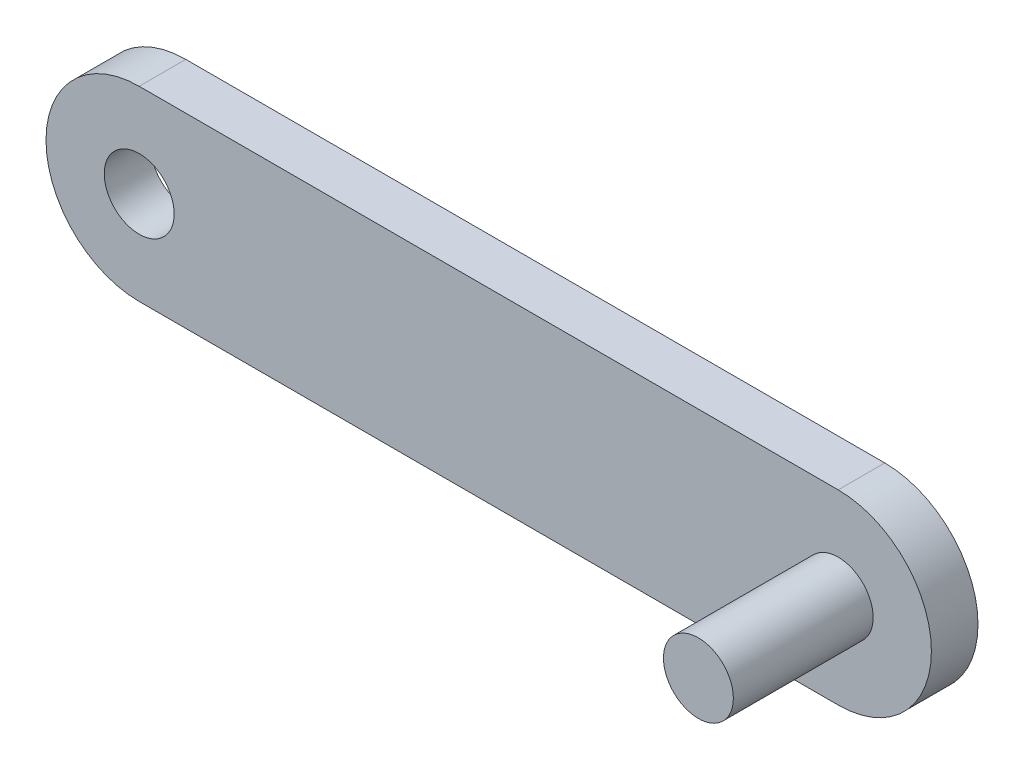
ISO-10303-21;
HEADER;
FILE_DESCRIPTION(('STEP AP214'),'2;1');
FILE_NAME('part.step','',(''),(''),'','','');
FILE_SCHEMA(('AUTOMOTIVE_DESIGN { 1 0 10303 214 1 1 1 1 }'));
ENDSEC;
DATA;
#1=APPLICATION_CONTEXT('core data for automotive mechanical design processes');
#2=APPLICATION_PROTOCOL_DEFINITION('international standard','automotive_design',2000,#1);
#3=PRODUCT_CONTEXT('',#1,'mechanical');
#4=PRODUCT('Part','Part','',(#3));
#5=PRODUCT_RELATED_PRODUCT_CATEGORY('part','',(#4));
#6=PRODUCT_DEFINITION_FORMATION('','',#4);
#7=PRODUCT_DEFINITION_CONTEXT('part definition',#1,'design');
#8=PRODUCT_DEFINITION('design','',#6,#7);
#9=PRODUCT_DEFINITION_SHAPE('','',#8);
#10=(LENGTH_UNIT() NAMED_UNIT(*) SI_UNIT(.MILLI.,.METRE.));
#11=(NAMED_UNIT(*) PLANE_ANGLE_UNIT() SI_UNIT($,.RADIAN.));
#12=(NAMED_UNIT(*) SI_UNIT($,.STERADIAN.) SOLID_ANGLE_UNIT());
#13=UNCERTAINTY_MEASURE_WITH_UNIT(LENGTH_MEASURE(1.E-05),#10,'distance_accuracy_value','');
#14=(GEOMETRIC_REPRESENTATION_CONTEXT(3) GLOBAL_UNCERTAINTY_ASSIGNED_CONTEXT((#13)) GLOBAL_UNIT_ASSIGNED_CONTEXT((#10,
#11,#12)) REPRESENTATION_CONTEXT('',''));
#15=CARTESIAN_POINT('',(0.,0.,0.));
#16=DIRECTION('',(0.,0.,1.));
#17=DIRECTION('',(1.,0.,0.));
#18=AXIS2_PLACEMENT_3D('',#15,#16,#17);
#19=CARTESIAN_POINT('',(0.,0.,2.));
#20=DIRECTION('',(0.,0.,1.));
#21=DIRECTION('',(1.,0.,0.));
#22=AXIS2_PLACEMENT_3D('',#19,#20,#21);
#23=PLANE('',#22);
#24=CARTESIAN_POINT('',(30.,0.,2.));
#25=DIRECTION('',(0.,0.,1.));
#26=DIRECTION('',(1.,0.,0.));
#27=AXIS2_PLACEMENT_3D('',#24,#25,#26);
#28=CIRCLE('',#27,1.5);
#29=CARTESIAN_POINT('',(31.5,0.,2.));
#30=VERTEX_POINT('',#29);
#31=EDGE_CURVE('E144',#30,#30,#28,.T.);
#32=ORIENTED_EDGE('',*,*,#31,.F.);
#33=EDGE_LOOP('',(#32));
#34=FACE_BOUND('',#33,.T.);
#35=CARTESIAN_POINT('',(0.,0.,2.));
#36=DIRECTION('',(0.,0.,1.));
#37=DIRECTION('',(1.,0.,0.));
#38=AXIS2_PLACEMENT_3D('',#35,#36,#37);
#39=CIRCLE('',#38,4.);
#40=CARTESIAN_POINT('',(0.,4.,2.));
#41=VERTEX_POINT('',#40);
#42=CARTESIAN_POINT('',(0.,-4.,2.));
#43=VERTEX_POINT('',#42);
#44=EDGE_CURVE('E98',#41,#43,#39,.T.);
#45=ORIENTED_EDGE('',*,*,#44,.T.);
#46=DIRECTION('',(1.,0.,0.));
#47=VECTOR('',#46,1.);
#48=CARTESIAN_POINT('',(0.,-4.,2.));
#49=LINE('',#48,#47);
#50=CARTESIAN_POINT('',(30.,-4.,2.));
#51=VERTEX_POINT('',#50);
#52=EDGE_CURVE('E93',#43,#51,#49,.T.);
#53=ORIENTED_EDGE('',*,*,#52,.T.);
#54=CARTESIAN_POINT('',(30.,0.,2.));
#55=DIRECTION('',(0.,0.,1.));
#56=DIRECTION('',(1.,0.,0.));
#57=AXIS2_PLACEMENT_3D('',#54,#55,#56);
#58=CIRCLE('',#57,4.);
#59=CARTESIAN_POINT('',(30.,4.,2.));
#60=VERTEX_POINT('',#59);
#61=EDGE_CURVE('E96',#51,#60,#58,.T.);
#62=ORIENTED_EDGE('',*,*,#61,.T.);
#63=DIRECTION('',(-1.,0.,0.));
#64=VECTOR('',#63,1.);
#65=CARTESIAN_POINT('',(0.,4.,2.));
#66=LINE('',#65,#64);
#67=EDGE_CURVE('E63',#60,#41,#66,.T.);
#68=ORIENTED_EDGE('',*,*,#67,.T.);
#69=EDGE_LOOP('',(#45,#53,#62,#68));
#70=FACE_BOUND('',#69,.T.);
#71=CARTESIAN_POINT('',(0.,0.,2.));
#72=DIRECTION('',(0.,0.,1.));
#73=DIRECTION('',(1.,0.,0.));
#74=AXIS2_PLACEMENT_3D('',#71,#72,#73);
#75=CIRCLE('',#74,1.5);
#76=CARTESIAN_POINT('',(1.5,0.,2.));
#77=VERTEX_POINT('',#76);
#78=EDGE_CURVE('E118',#77,#77,#75,.T.);
#79=ORIENTED_EDGE('',*,*,#78,.F.);
#80=EDGE_LOOP('',(#79));
#81=FACE_BOUND('',#80,.T.);
#82=ADVANCED_FACE('F45',(#34,#70,#81),#23,.T.);
#83=CARTESIAN_POINT('',(0.,0.,0.));
#84=DIRECTION('',(0.,0.,1.));
#85=DIRECTION('',(1.,0.,0.));
#86=AXIS2_PLACEMENT_3D('',#83,#84,#85);
#87=PLANE('',#86);
#88=CARTESIAN_POINT('',(0.,0.,0.));
#89=DIRECTION('',(0.,0.,1.));
#90=DIRECTION('',(1.,0.,0.));
#91=AXIS2_PLACEMENT_3D('',#88,#89,#90);
#92=CIRCLE('',#91,4.);
#93=CARTESIAN_POINT('',(0.,4.,0.));
#94=VERTEX_POINT('',#93);
#95=CARTESIAN_POINT('',(0.,-4.,0.));
#96=VERTEX_POINT('',#95);
#97=EDGE_CURVE('E114',#94,#96,#92,.T.);
#98=ORIENTED_EDGE('',*,*,#97,.F.);
#99=DIRECTION('',(-1.,0.,0.));
#100=VECTOR('',#99,1.);
#101=CARTESIAN_POINT('',(0.,4.,0.));
#102=LINE('',#101,#100);
#103=CARTESIAN_POINT('',(30.,4.,0.));
#104=VERTEX_POINT('',#103);
#105=EDGE_CURVE('E86',#104,#94,#102,.T.);
#106=ORIENTED_EDGE('',*,*,#105,.F.);
#107=CARTESIAN_POINT('',(30.,0.,0.));
#108=DIRECTION('',(0.,0.,1.));
#109=DIRECTION('',(1.,0.,0.));
#110=AXIS2_PLACEMENT_3D('',#107,#108,#109);
#111=CIRCLE('',#110,4.);
#112=CARTESIAN_POINT('',(30.,-4.,0.));
#113=VERTEX_POINT('',#112);
#114=EDGE_CURVE('E80',#113,#104,#111,.T.);
#115=ORIENTED_EDGE('',*,*,#114,.F.);
#116=DIRECTION('',(1.,0.,0.));
#117=VECTOR('',#116,1.);
#118=CARTESIAN_POINT('',(0.,-4.,0.));
#119=LINE('',#118,#117);
#120=EDGE_CURVE('E103',#96,#113,#119,.T.);
#121=ORIENTED_EDGE('',*,*,#120,.F.);
#122=EDGE_LOOP('',(#98,#106,#115,#121));
#123=FACE_BOUND('',#122,.T.);
#124=CARTESIAN_POINT('',(0.,0.,0.));
#125=DIRECTION('',(0.,0.,1.));
#126=DIRECTION('',(1.,0.,0.));
#127=AXIS2_PLACEMENT_3D('',#124,#125,#126);
#128=CIRCLE('',#127,1.5);
#129=CARTESIAN_POINT('',(1.5,0.,0.));
#130=VERTEX_POINT('',#129);
#131=EDGE_CURVE('E136',#130,#130,#128,.T.);
#132=ORIENTED_EDGE('',*,*,#131,.T.);
#133=EDGE_LOOP('',(#132));
#134=FACE_BOUND('',#133,.T.);
#135=ADVANCED_FACE('F131',(#123,#134),#87,.F.);
#136=CARTESIAN_POINT('',(0.,0.,2.));
#137=DIRECTION('',(0.,0.,-1.));
#138=DIRECTION('',(-1.,0.,0.));
#139=AXIS2_PLACEMENT_3D('',#136,#137,#138);
#140=CYLINDRICAL_SURFACE('',#139,4.);
#141=ORIENTED_EDGE('',*,*,#97,.T.);
#142=DIRECTION('',(0.,0.,-1.));
#143=VECTOR('',#142,1.);
#144=CARTESIAN_POINT('',(0.,-4.,2.));
#145=LINE('',#144,#143);
#146=EDGE_CURVE('E11',#43,#96,#145,.T.);
#147=ORIENTED_EDGE('',*,*,#146,.F.);
#148=ORIENTED_EDGE('',*,*,#44,.F.);
#149=DIRECTION('',(0.,0.,-1.));
#150=VECTOR('',#149,1.);
#151=CARTESIAN_POINT('',(0.,4.,2.));
#152=LINE('',#151,#150);
#153=EDGE_CURVE('E110',#41,#94,#152,.T.);
#154=ORIENTED_EDGE('',*,*,#153,.T.);
#155=EDGE_LOOP('',(#141,#147,#148,#154));
#156=FACE_BOUND('',#155,.T.);
#157=ADVANCED_FACE('F47',(#156),#140,.T.);
#158=CARTESIAN_POINT('',(0.,-4.,2.));
#159=DIRECTION('',(0.,1.,0.));
#160=DIRECTION('',(0.,0.,1.));
#161=AXIS2_PLACEMENT_3D('',#158,#159,#160);
#162=PLANE('',#161);
#163=ORIENTED_EDGE('',*,*,#120,.T.);
#164=DIRECTION('',(0.,0.,-1.));
#165=VECTOR('',#164,1.);
#166=CARTESIAN_POINT('',(30.,-4.,2.));
#167=LINE('',#166,#165);
#168=EDGE_CURVE('E55',#51,#113,#167,.T.);
#169=ORIENTED_EDGE('',*,*,#168,.F.);
#170=ORIENTED_EDGE('',*,*,#52,.F.);
#171=ORIENTED_EDGE('',*,*,#146,.T.);
#172=EDGE_LOOP('',(#163,#169,#170,#171));
#173=FACE_BOUND('',#172,.T.);
#174=ADVANCED_FACE('F102',(#173),#162,.F.);
#175=CARTESIAN_POINT('',(30.,0.,2.));
#176=DIRECTION('',(0.,0.,-1.));
#177=DIRECTION('',(-1.,0.,0.));
#178=AXIS2_PLACEMENT_3D('',#175,#176,#177);
#179=CYLINDRICAL_SURFACE('',#178,4.);
#180=ORIENTED_EDGE('',*,*,#114,.T.);
#181=DIRECTION('',(0.,0.,-1.));
#182=VECTOR('',#181,1.);
#183=CARTESIAN_POINT('',(30.,4.,2.));
#184=LINE('',#183,#182);
#185=EDGE_CURVE('E105',#60,#104,#184,.T.);
#186=ORIENTED_EDGE('',*,*,#185,.F.);
#187=ORIENTED_EDGE('',*,*,#61,.F.);
#188=ORIENTED_EDGE('',*,*,#168,.T.);
#189=EDGE_LOOP('',(#180,#186,#187,#188));
#190=FACE_BOUND('',#189,.T.);
#191=ADVANCED_FACE('F106',(#190),#179,.T.);
#192=CARTESIAN_POINT('',(0.,4.,2.));
#193=DIRECTION('',(0.,-1.,0.));
#194=DIRECTION('',(0.,0.,-1.));
#195=AXIS2_PLACEMENT_3D('',#192,#193,#194);
#196=PLANE('',#195);
#197=ORIENTED_EDGE('',*,*,#105,.T.);
#198=ORIENTED_EDGE('',*,*,#153,.F.);
#199=ORIENTED_EDGE('',*,*,#67,.F.);
#200=ORIENTED_EDGE('',*,*,#185,.T.);
#201=EDGE_LOOP('',(#197,#198,#199,#200));
#202=FACE_BOUND('',#201,.T.);
#203=ADVANCED_FACE('F128',(#202),#196,.F.);
#204=CARTESIAN_POINT('',(0.,0.,2.));
#205=DIRECTION('',(0.,0.,-1.));
#206=DIRECTION('',(-1.,0.,0.));
#207=AXIS2_PLACEMENT_3D('',#204,#205,#206);
#208=CYLINDRICAL_SURFACE('',#207,1.5);
#209=ORIENTED_EDGE('',*,*,#78,.T.);
#210=EDGE_LOOP('',(#209));
#211=FACE_BOUND('',#210,.T.);
#212=ORIENTED_EDGE('',*,*,#131,.F.);
#213=EDGE_LOOP('',(#212));
#214=FACE_BOUND('',#213,.T.);
#215=ADVANCED_FACE('F157',(#211,#214),#208,.F.);
#216=CARTESIAN_POINT('',(30.,0.,8.));
#217=DIRECTION('',(0.,0.,-1.));
#218=DIRECTION('',(-1.,0.,0.));
#219=AXIS2_PLACEMENT_3D('',#216,#217,#218);
#220=CYLINDRICAL_SURFACE('',#219,1.5);
#221=CARTESIAN_POINT('',(30.,0.,8.));
#222=DIRECTION('',(0.,0.,1.));
#223=DIRECTION('',(1.,0.,0.));
#224=AXIS2_PLACEMENT_3D('',#221,#222,#223);
#225=CIRCLE('',#224,1.5);
#226=CARTESIAN_POINT('',(31.5,0.,8.));
#227=VERTEX_POINT('',#226);
#228=EDGE_CURVE('E140',#227,#227,#225,.T.);
#229=ORIENTED_EDGE('',*,*,#228,.F.);
#230=EDGE_LOOP('',(#229));
#231=FACE_BOUND('',#230,.T.);
#232=ORIENTED_EDGE('',*,*,#31,.T.);
#233=EDGE_LOOP('',(#232));
#234=FACE_BOUND('',#233,.T.);
#235=ADVANCED_FACE('F154',(#231,#234),#220,.T.);
#236=CARTESIAN_POINT('',(30.,0.,8.));
#237=DIRECTION('',(0.,0.,1.));
#238=DIRECTION('',(1.,0.,0.));
#239=AXIS2_PLACEMENT_3D('',#236,#237,#238);
#240=PLANE('',#239);
#241=ORIENTED_EDGE('',*,*,#228,.T.);
#242=EDGE_LOOP('',(#241));
#243=FACE_BOUND('',#242,.T.);
#244=ADVANCED_FACE('F152',(#243),#240,.T.);
#245=CLOSED_SHELL('',(#82,#135,#157,#174,#191,#203,#215,#235,#244));
#246=MANIFOLD_SOLID_BREP('B2',#245);
#247=ADVANCED_BREP_SHAPE_REPRESENTATION('',(#18,#246),#14);
#248=SHAPE_DEFINITION_REPRESENTATION(#9,#247);
ENDSEC;
END-ISO-10303-21;
